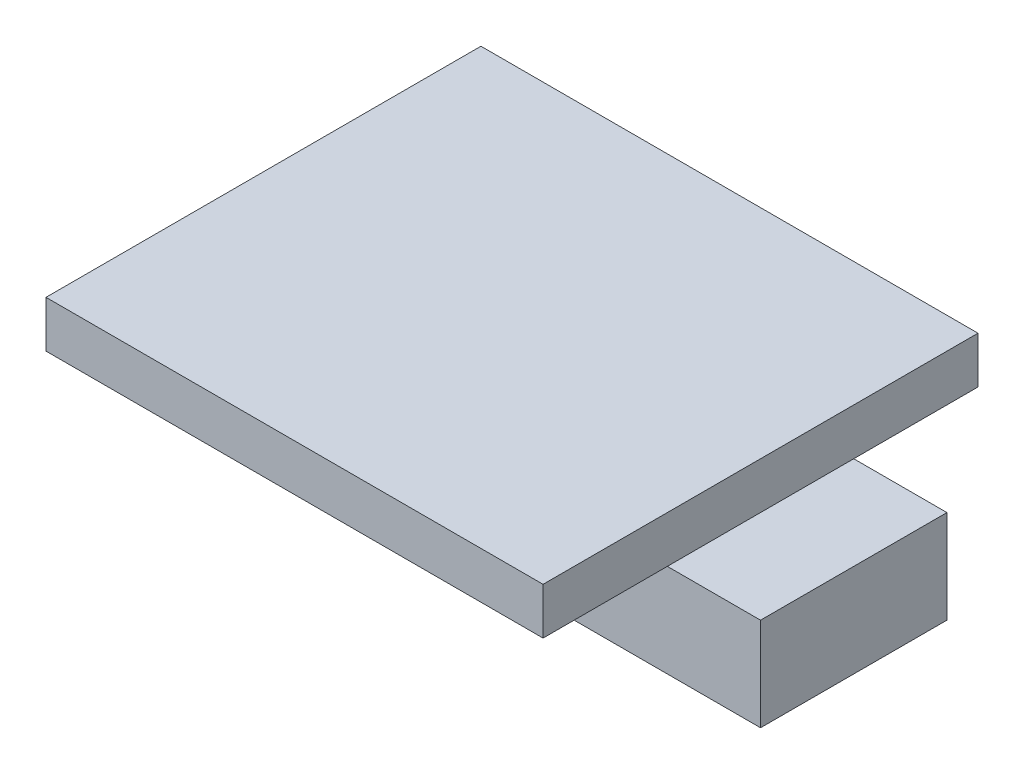
ISO-10303-21;
HEADER;
FILE_DESCRIPTION(('STEP AP214'),'2;1');
FILE_NAME('part.step','',(''),(''),'','','');
FILE_SCHEMA(('AUTOMOTIVE_DESIGN { 1 0 10303 214 1 1 1 1 }'));
ENDSEC;
DATA;
#1=APPLICATION_CONTEXT('core data for automotive mechanical design processes');
#2=APPLICATION_PROTOCOL_DEFINITION('international standard','automotive_design',2000,#1);
#3=PRODUCT_CONTEXT('',#1,'mechanical');
#4=PRODUCT('Part','Part','',(#3));
#5=PRODUCT_RELATED_PRODUCT_CATEGORY('part','',(#4));
#6=PRODUCT_DEFINITION_FORMATION('','',#4);
#7=PRODUCT_DEFINITION_CONTEXT('part definition',#1,'design');
#8=PRODUCT_DEFINITION('design','',#6,#7);
#9=PRODUCT_DEFINITION_SHAPE('','',#8);
#10=(LENGTH_UNIT() NAMED_UNIT(*) SI_UNIT(.MILLI.,.METRE.));
#11=(NAMED_UNIT(*) PLANE_ANGLE_UNIT() SI_UNIT($,.RADIAN.));
#12=(NAMED_UNIT(*) SI_UNIT($,.STERADIAN.) SOLID_ANGLE_UNIT());
#13=UNCERTAINTY_MEASURE_WITH_UNIT(LENGTH_MEASURE(1.E-05),#10,'distance_accuracy_value','');
#14=(GEOMETRIC_REPRESENTATION_CONTEXT(3) GLOBAL_UNCERTAINTY_ASSIGNED_CONTEXT((#13)) GLOBAL_UNIT_ASSIGNED_CONTEXT((#10,
#11,#12)) REPRESENTATION_CONTEXT('',''));
#15=CARTESIAN_POINT('',(0.,0.,0.));
#16=DIRECTION('',(0.,0.,1.));
#17=DIRECTION('',(1.,0.,0.));
#18=AXIS2_PLACEMENT_3D('',#15,#16,#17);
#19=CARTESIAN_POINT('',(80.,15.,70.));
#20=DIRECTION('',(-1.,0.,0.));
#21=DIRECTION('',(0.,0.,1.));
#22=AXIS2_PLACEMENT_3D('',#19,#20,#21);
#23=PLANE('',#22);
#24=DIRECTION('',(0.,0.,-1.));
#25=VECTOR('',#24,1.);
#26=CARTESIAN_POINT('',(80.,0.,70.));
#27=LINE('',#26,#25);
#28=CARTESIAN_POINT('',(80.,0.,70.));
#29=VERTEX_POINT('',#28);
#30=CARTESIAN_POINT('',(80.,0.,30.));
#31=VERTEX_POINT('',#30);
#32=EDGE_CURVE('E134',#29,#31,#27,.T.);
#33=ORIENTED_EDGE('',*,*,#32,.T.);
#34=CARTESIAN_POINT('',(80.,0.,-30.));
#35=VERTEX_POINT('',#34);
#36=EDGE_CURVE('E132',#31,#35,#27,.T.);
#37=ORIENTED_EDGE('',*,*,#36,.T.);
#38=CARTESIAN_POINT('',(80.,0.,-70.));
#39=VERTEX_POINT('',#38);
#40=EDGE_CURVE('E56',#35,#39,#27,.T.);
#41=ORIENTED_EDGE('',*,*,#40,.T.);
#42=DIRECTION('',(0.,-1.,0.));
#43=VECTOR('',#42,1.);
#44=CARTESIAN_POINT('',(80.,15.,-70.));
#45=LINE('',#44,#43);
#46=CARTESIAN_POINT('',(80.,15.,-70.));
#47=VERTEX_POINT('',#46);
#48=EDGE_CURVE('E38',#47,#39,#45,.T.);
#49=ORIENTED_EDGE('',*,*,#48,.F.);
#50=DIRECTION('',(0.,0.,-1.));
#51=VECTOR('',#50,1.);
#52=CARTESIAN_POINT('',(80.,15.,70.));
#53=LINE('',#52,#51);
#54=CARTESIAN_POINT('',(80.,15.,70.));
#55=VERTEX_POINT('',#54);
#56=EDGE_CURVE('E139',#55,#47,#53,.T.);
#57=ORIENTED_EDGE('',*,*,#56,.F.);
#58=DIRECTION('',(0.,-1.,0.));
#59=VECTOR('',#58,1.);
#60=CARTESIAN_POINT('',(80.,15.,70.));
#61=LINE('',#60,#59);
#62=EDGE_CURVE('E148',#55,#29,#61,.T.);
#63=ORIENTED_EDGE('',*,*,#62,.T.);
#64=EDGE_LOOP('',(#33,#37,#41,#49,#57,#63));
#65=FACE_BOUND('',#64,.T.);
#66=ADVANCED_FACE('F35',(#65),#23,.F.);
#67=CARTESIAN_POINT('',(-80.,15.,-70.));
#68=DIRECTION('',(0.,0.,1.));
#69=DIRECTION('',(1.,0.,0.));
#70=AXIS2_PLACEMENT_3D('',#67,#68,#69);
#71=PLANE('',#70);
#72=DIRECTION('',(-1.,0.,0.));
#73=VECTOR('',#72,1.);
#74=CARTESIAN_POINT('',(-80.,0.,-70.));
#75=LINE('',#74,#73);
#76=CARTESIAN_POINT('',(-80.,0.,-70.));
#77=VERTEX_POINT('',#76);
#78=EDGE_CURVE('E151',#39,#77,#75,.T.);
#79=ORIENTED_EDGE('',*,*,#78,.T.);
#80=DIRECTION('',(0.,-1.,0.));
#81=VECTOR('',#80,1.);
#82=CARTESIAN_POINT('',(-80.,15.,-70.));
#83=LINE('',#82,#81);
#84=CARTESIAN_POINT('',(-80.,15.,-70.));
#85=VERTEX_POINT('',#84);
#86=EDGE_CURVE('E160',#85,#77,#83,.T.);
#87=ORIENTED_EDGE('',*,*,#86,.F.);
#88=DIRECTION('',(-1.,0.,0.));
#89=VECTOR('',#88,1.);
#90=CARTESIAN_POINT('',(-80.,15.,-70.));
#91=LINE('',#90,#89);
#92=EDGE_CURVE('E142',#47,#85,#91,.T.);
#93=ORIENTED_EDGE('',*,*,#92,.F.);
#94=ORIENTED_EDGE('',*,*,#48,.T.);
#95=EDGE_LOOP('',(#79,#87,#93,#94));
#96=FACE_BOUND('',#95,.T.);
#97=ADVANCED_FACE('F169',(#96),#71,.F.);
#98=CARTESIAN_POINT('',(-80.,15.,70.));
#99=DIRECTION('',(1.,0.,0.));
#100=DIRECTION('',(0.,0.,-1.));
#101=AXIS2_PLACEMENT_3D('',#98,#99,#100);
#102=PLANE('',#101);
#103=DIRECTION('',(0.,0.,1.));
#104=VECTOR('',#103,1.);
#105=CARTESIAN_POINT('',(-80.,0.,70.));
#106=LINE('',#105,#104);
#107=CARTESIAN_POINT('',(-80.,0.,70.));
#108=VERTEX_POINT('',#107);
#109=EDGE_CURVE('E153',#77,#108,#106,.T.);
#110=ORIENTED_EDGE('',*,*,#109,.T.);
#111=DIRECTION('',(0.,-1.,0.));
#112=VECTOR('',#111,1.);
#113=CARTESIAN_POINT('',(-80.,15.,70.));
#114=LINE('',#113,#112);
#115=CARTESIAN_POINT('',(-80.,15.,70.));
#116=VERTEX_POINT('',#115);
#117=EDGE_CURVE('E158',#116,#108,#114,.T.);
#118=ORIENTED_EDGE('',*,*,#117,.F.);
#119=DIRECTION('',(0.,0.,1.));
#120=VECTOR('',#119,1.);
#121=CARTESIAN_POINT('',(-80.,15.,70.));
#122=LINE('',#121,#120);
#123=EDGE_CURVE('E145',#85,#116,#122,.T.);
#124=ORIENTED_EDGE('',*,*,#123,.F.);
#125=ORIENTED_EDGE('',*,*,#86,.T.);
#126=EDGE_LOOP('',(#110,#118,#124,#125));
#127=FACE_BOUND('',#126,.T.);
#128=ADVANCED_FACE('F178',(#127),#102,.F.);
#129=CARTESIAN_POINT('',(-80.,15.,70.));
#130=DIRECTION('',(0.,0.,-1.));
#131=DIRECTION('',(-1.,0.,0.));
#132=AXIS2_PLACEMENT_3D('',#129,#130,#131);
#133=PLANE('',#132);
#134=DIRECTION('',(1.,0.,0.));
#135=VECTOR('',#134,1.);
#136=CARTESIAN_POINT('',(-80.,0.,70.));
#137=LINE('',#136,#135);
#138=EDGE_CURVE('E143',#108,#29,#137,.T.);
#139=ORIENTED_EDGE('',*,*,#138,.T.);
#140=ORIENTED_EDGE('',*,*,#62,.F.);
#141=DIRECTION('',(1.,0.,0.));
#142=VECTOR('',#141,1.);
#143=CARTESIAN_POINT('',(-80.,15.,70.));
#144=LINE('',#143,#142);
#145=EDGE_CURVE('E147',#116,#55,#144,.T.);
#146=ORIENTED_EDGE('',*,*,#145,.F.);
#147=ORIENTED_EDGE('',*,*,#117,.T.);
#148=EDGE_LOOP('',(#139,#140,#146,#147));
#149=FACE_BOUND('',#148,.T.);
#150=ADVANCED_FACE('F181',(#149),#133,.F.);
#151=CARTESIAN_POINT('',(0.,15.,0.));
#152=DIRECTION('',(0.,-1.,0.));
#153=DIRECTION('',(0.,0.,-1.));
#154=AXIS2_PLACEMENT_3D('',#151,#152,#153);
#155=PLANE('',#154);
#156=ORIENTED_EDGE('',*,*,#56,.T.);
#157=ORIENTED_EDGE('',*,*,#92,.T.);
#158=ORIENTED_EDGE('',*,*,#123,.T.);
#159=ORIENTED_EDGE('',*,*,#145,.T.);
#160=EDGE_LOOP('',(#156,#157,#158,#159));
#161=FACE_BOUND('',#160,.T.);
#162=ADVANCED_FACE('F184',(#161),#155,.F.);
#163=CARTESIAN_POINT('',(0.,0.,0.));
#164=DIRECTION('',(0.,-1.,0.));
#165=DIRECTION('',(0.,0.,-1.));
#166=AXIS2_PLACEMENT_3D('',#163,#164,#165);
#167=PLANE('',#166);
#168=DIRECTION('',(1.,0.,0.));
#169=VECTOR('',#168,1.);
#170=CARTESIAN_POINT('',(50.,0.,-30.));
#171=LINE('',#170,#169);
#172=CARTESIAN_POINT('',(50.,0.,-30.));
#173=VERTEX_POINT('',#172);
#174=EDGE_CURVE('E51',#173,#35,#171,.T.);
#175=ORIENTED_EDGE('',*,*,#174,.F.);
#176=DIRECTION('',(0.,0.,-1.));
#177=VECTOR('',#176,1.);
#178=CARTESIAN_POINT('',(50.,0.,-30.));
#179=LINE('',#178,#177);
#180=CARTESIAN_POINT('',(50.,0.,30.));
#181=VERTEX_POINT('',#180);
#182=EDGE_CURVE('E284',#181,#173,#179,.T.);
#183=ORIENTED_EDGE('',*,*,#182,.F.);
#184=DIRECTION('',(-1.,0.,0.));
#185=VECTOR('',#184,1.);
#186=CARTESIAN_POINT('',(50.,0.,30.));
#187=LINE('',#186,#185);
#188=EDGE_CURVE('E11',#31,#181,#187,.T.);
#189=ORIENTED_EDGE('',*,*,#188,.F.);
#190=ORIENTED_EDGE('',*,*,#32,.F.);
#191=ORIENTED_EDGE('',*,*,#138,.F.);
#192=ORIENTED_EDGE('',*,*,#109,.F.);
#193=ORIENTED_EDGE('',*,*,#78,.F.);
#194=ORIENTED_EDGE('',*,*,#40,.F.);
#195=EDGE_LOOP('',(#175,#183,#189,#190,#191,#192,#193,#194));
#196=FACE_BOUND('',#195,.T.);
#197=ADVANCED_FACE('F174',(#196),#167,.T.);
#198=CARTESIAN_POINT('',(0.,0.,0.));
#199=DIRECTION('',(0.,1.,0.));
#200=DIRECTION('',(0.,0.,1.));
#201=AXIS2_PLACEMENT_3D('',#198,#199,#200);
#202=PLANE('',#201);
#203=ORIENTED_EDGE('',*,*,#36,.F.);
#204=CARTESIAN_POINT('',(110.,0.,30.));
#205=VERTEX_POINT('',#204);
#206=EDGE_CURVE('E44',#205,#31,#187,.T.);
#207=ORIENTED_EDGE('',*,*,#206,.F.);
#208=DIRECTION('',(0.,0.,1.));
#209=VECTOR('',#208,1.);
#210=CARTESIAN_POINT('',(110.,0.,-30.));
#211=LINE('',#210,#209);
#212=CARTESIAN_POINT('',(110.,0.,-30.));
#213=VERTEX_POINT('',#212);
#214=EDGE_CURVE('E130',#213,#205,#211,.T.);
#215=ORIENTED_EDGE('',*,*,#214,.F.);
#216=EDGE_CURVE('E281',#35,#213,#171,.T.);
#217=ORIENTED_EDGE('',*,*,#216,.F.);
#218=EDGE_LOOP('',(#203,#207,#215,#217));
#219=FACE_BOUND('',#218,.T.);
#220=ADVANCED_FACE('F191',(#219),#202,.T.);
#221=CARTESIAN_POINT('',(110.,-30.,-30.));
#222=DIRECTION('',(-1.,0.,0.));
#223=DIRECTION('',(0.,0.,1.));
#224=AXIS2_PLACEMENT_3D('',#221,#222,#223);
#225=PLANE('',#224);
#226=ORIENTED_EDGE('',*,*,#214,.T.);
#227=DIRECTION('',(0.,1.,0.));
#228=VECTOR('',#227,1.);
#229=CARTESIAN_POINT('',(110.,-30.,30.));
#230=LINE('',#229,#228);
#231=CARTESIAN_POINT('',(110.,-30.,30.));
#232=VERTEX_POINT('',#231);
#233=EDGE_CURVE('E111',#232,#205,#230,.T.);
#234=ORIENTED_EDGE('',*,*,#233,.F.);
#235=DIRECTION('',(0.,0.,1.));
#236=VECTOR('',#235,1.);
#237=CARTESIAN_POINT('',(110.,-30.,-30.));
#238=LINE('',#237,#236);
#239=CARTESIAN_POINT('',(110.,-30.,-30.));
#240=VERTEX_POINT('',#239);
#241=EDGE_CURVE('E118',#240,#232,#238,.T.);
#242=ORIENTED_EDGE('',*,*,#241,.F.);
#243=DIRECTION('',(0.,1.,0.));
#244=VECTOR('',#243,1.);
#245=CARTESIAN_POINT('',(110.,-30.,-30.));
#246=LINE('',#245,#244);
#247=EDGE_CURVE('E287',#240,#213,#246,.T.);
#248=ORIENTED_EDGE('',*,*,#247,.T.);
#249=EDGE_LOOP('',(#226,#234,#242,#248));
#250=FACE_BOUND('',#249,.T.);
#251=ADVANCED_FACE('F128',(#250),#225,.F.);
#252=CARTESIAN_POINT('',(50.,-30.,30.));
#253=DIRECTION('',(0.,0.,-1.));
#254=DIRECTION('',(-1.,0.,0.));
#255=AXIS2_PLACEMENT_3D('',#252,#253,#254);
#256=PLANE('',#255);
#257=ORIENTED_EDGE('',*,*,#206,.T.);
#258=ORIENTED_EDGE('',*,*,#188,.T.);
#259=DIRECTION('',(0.,1.,0.));
#260=VECTOR('',#259,1.);
#261=CARTESIAN_POINT('',(50.,-30.,30.));
#262=LINE('',#261,#260);
#263=CARTESIAN_POINT('',(50.,-30.,30.));
#264=VERTEX_POINT('',#263);
#265=EDGE_CURVE('E114',#264,#181,#262,.T.);
#266=ORIENTED_EDGE('',*,*,#265,.F.);
#267=DIRECTION('',(-1.,0.,0.));
#268=VECTOR('',#267,1.);
#269=CARTESIAN_POINT('',(50.,-30.,30.));
#270=LINE('',#269,#268);
#271=EDGE_CURVE('E106',#232,#264,#270,.T.);
#272=ORIENTED_EDGE('',*,*,#271,.F.);
#273=ORIENTED_EDGE('',*,*,#233,.T.);
#274=EDGE_LOOP('',(#257,#258,#266,#272,#273));
#275=FACE_BOUND('',#274,.T.);
#276=ADVANCED_FACE('F109',(#275),#256,.F.);
#277=CARTESIAN_POINT('',(50.,-30.,-30.));
#278=DIRECTION('',(1.,0.,0.));
#279=DIRECTION('',(0.,0.,-1.));
#280=AXIS2_PLACEMENT_3D('',#277,#278,#279);
#281=PLANE('',#280);
#282=ORIENTED_EDGE('',*,*,#182,.T.);
#283=DIRECTION('',(0.,1.,0.));
#284=VECTOR('',#283,1.);
#285=CARTESIAN_POINT('',(50.,-30.,-30.));
#286=LINE('',#285,#284);
#287=CARTESIAN_POINT('',(50.,-30.,-30.));
#288=VERTEX_POINT('',#287);
#289=EDGE_CURVE('E135',#288,#173,#286,.T.);
#290=ORIENTED_EDGE('',*,*,#289,.F.);
#291=DIRECTION('',(0.,0.,-1.));
#292=VECTOR('',#291,1.);
#293=CARTESIAN_POINT('',(50.,-30.,-30.));
#294=LINE('',#293,#292);
#295=EDGE_CURVE('E117',#264,#288,#294,.T.);
#296=ORIENTED_EDGE('',*,*,#295,.F.);
#297=ORIENTED_EDGE('',*,*,#265,.T.);
#298=EDGE_LOOP('',(#282,#290,#296,#297));
#299=FACE_BOUND('',#298,.T.);
#300=ADVANCED_FACE('F249',(#299),#281,.F.);
#301=CARTESIAN_POINT('',(50.,-30.,-30.));
#302=DIRECTION('',(0.,0.,1.));
#303=DIRECTION('',(1.,0.,0.));
#304=AXIS2_PLACEMENT_3D('',#301,#302,#303);
#305=PLANE('',#304);
#306=ORIENTED_EDGE('',*,*,#174,.T.);
#307=ORIENTED_EDGE('',*,*,#216,.T.);
#308=ORIENTED_EDGE('',*,*,#247,.F.);
#309=DIRECTION('',(1.,0.,0.));
#310=VECTOR('',#309,1.);
#311=CARTESIAN_POINT('',(50.,-30.,-30.));
#312=LINE('',#311,#310);
#313=EDGE_CURVE('E123',#288,#240,#312,.T.);
#314=ORIENTED_EDGE('',*,*,#313,.F.);
#315=ORIENTED_EDGE('',*,*,#289,.T.);
#316=EDGE_LOOP('',(#306,#307,#308,#314,#315));
#317=FACE_BOUND('',#316,.T.);
#318=ADVANCED_FACE('F258',(#317),#305,.F.);
#319=CARTESIAN_POINT('',(0.,-30.,0.));
#320=DIRECTION('',(0.,1.,0.));
#321=DIRECTION('',(0.,0.,1.));
#322=AXIS2_PLACEMENT_3D('',#319,#320,#321);
#323=PLANE('',#322);
#324=ORIENTED_EDGE('',*,*,#241,.T.);
#325=ORIENTED_EDGE('',*,*,#271,.T.);
#326=ORIENTED_EDGE('',*,*,#295,.T.);
#327=ORIENTED_EDGE('',*,*,#313,.T.);
#328=EDGE_LOOP('',(#324,#325,#326,#327));
#329=FACE_BOUND('',#328,.T.);
#330=ADVANCED_FACE('F121',(#329),#323,.F.);
#331=CLOSED_SHELL('',(#66,#97,#128,#150,#162,#197,#220,#251,#276,#300,#318,#330));
#332=MANIFOLD_SOLID_BREP('B2',#331);
#333=ADVANCED_BREP_SHAPE_REPRESENTATION('',(#18,#332),#14);
#334=SHAPE_DEFINITION_REPRESENTATION(#9,#333);
ENDSEC;
END-ISO-10303-21;
